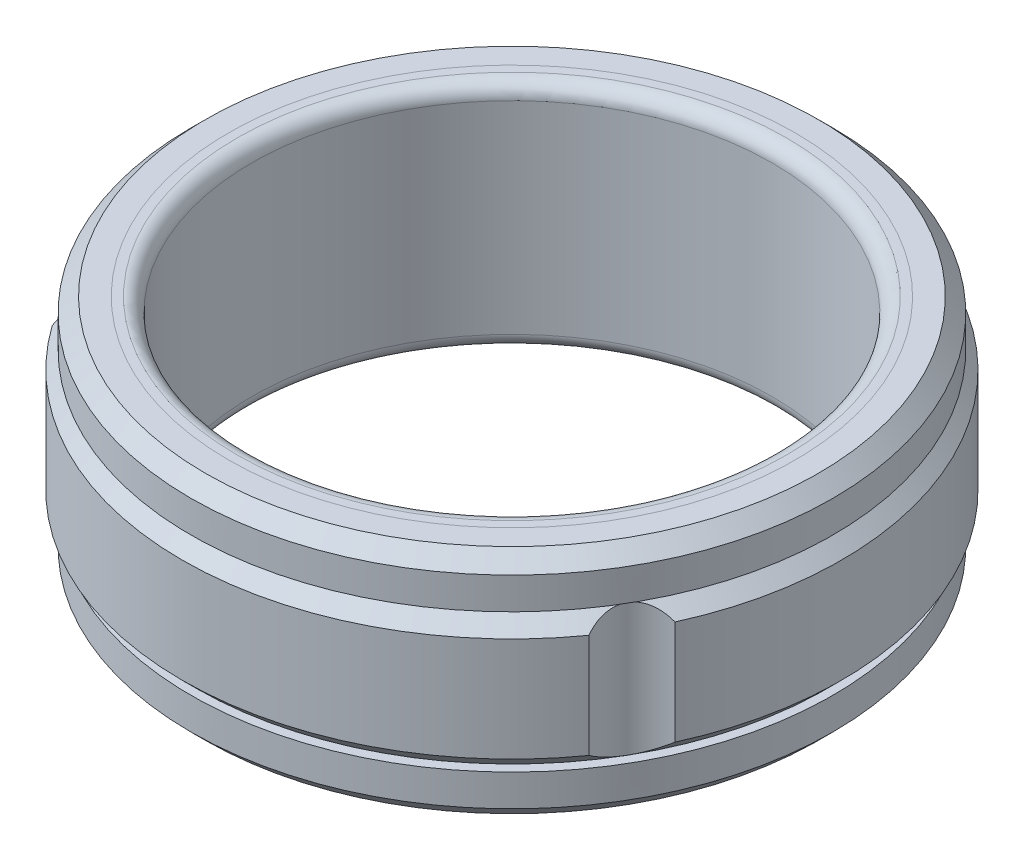
ISO-10303-21;
HEADER;
FILE_DESCRIPTION(('STEP AP214'),'2;1');
FILE_NAME('part.step','',(''),(''),'','','');
FILE_SCHEMA(('AUTOMOTIVE_DESIGN { 1 0 10303 214 1 1 1 1 }'));
ENDSEC;
DATA;
#1=APPLICATION_CONTEXT('core data for automotive mechanical design processes');
#2=APPLICATION_PROTOCOL_DEFINITION('international standard','automotive_design',2000,#1);
#3=PRODUCT_CONTEXT('',#1,'mechanical');
#4=PRODUCT('Part','Part','',(#3));
#5=PRODUCT_RELATED_PRODUCT_CATEGORY('part','',(#4));
#6=PRODUCT_DEFINITION_FORMATION('','',#4);
#7=PRODUCT_DEFINITION_CONTEXT('part definition',#1,'design');
#8=PRODUCT_DEFINITION('design','',#6,#7);
#9=PRODUCT_DEFINITION_SHAPE('','',#8);
#10=(LENGTH_UNIT() NAMED_UNIT(*) SI_UNIT(.MILLI.,.METRE.));
#11=(NAMED_UNIT(*) PLANE_ANGLE_UNIT() SI_UNIT($,.RADIAN.));
#12=(NAMED_UNIT(*) SI_UNIT($,.STERADIAN.) SOLID_ANGLE_UNIT());
#13=UNCERTAINTY_MEASURE_WITH_UNIT(LENGTH_MEASURE(1.E-05),#10,'distance_accuracy_value','');
#14=(GEOMETRIC_REPRESENTATION_CONTEXT(3) GLOBAL_UNCERTAINTY_ASSIGNED_CONTEXT((#13)) GLOBAL_UNIT_ASSIGNED_CONTEXT((#10,
#11,#12)) REPRESENTATION_CONTEXT('',''));
#15=CARTESIAN_POINT('',(0.,0.,0.));
#16=DIRECTION('',(0.,0.,1.));
#17=DIRECTION('',(1.,0.,0.));
#18=AXIS2_PLACEMENT_3D('',#15,#16,#17);
#19=CARTESIAN_POINT('',(0.,-2.4,0.));
#20=DIRECTION('',(0.,-1.,0.));
#21=DIRECTION('',(0.,0.,-1.));
#22=AXIS2_PLACEMENT_3D('',#19,#20,#21);
#23=PLANE('',#22);
#24=CARTESIAN_POINT('',(0.,-2.4,0.));
#25=DIRECTION('',(0.,-1.,0.));
#26=DIRECTION('',(0.,0.,-1.));
#27=AXIS2_PLACEMENT_3D('',#24,#25,#26);
#28=CIRCLE('',#27,11.1);
#29=CARTESIAN_POINT('',(0.,-2.4,-11.1));
#30=VERTEX_POINT('',#29);
#31=EDGE_CURVE('E70',#30,#30,#28,.T.);
#32=ORIENTED_EDGE('',*,*,#31,.F.);
#33=EDGE_LOOP('',(#32));
#34=FACE_BOUND('',#33,.T.);
#35=CARTESIAN_POINT('',(0.,-2.4,0.));
#36=DIRECTION('',(0.,-1.,0.));
#37=DIRECTION('',(0.,0.,-1.));
#38=AXIS2_PLACEMENT_3D('',#35,#36,#37);
#39=CIRCLE('',#38,9.8);
#40=CARTESIAN_POINT('',(0.,-2.4,-9.8));
#41=VERTEX_POINT('',#40);
#42=EDGE_CURVE('E79',#41,#41,#39,.T.);
#43=ORIENTED_EDGE('',*,*,#42,.T.);
#44=EDGE_LOOP('',(#43));
#45=FACE_BOUND('',#44,.T.);
#46=ADVANCED_FACE('F58',(#34,#45),#23,.F.);
#47=CARTESIAN_POINT('',(0.,0.,0.));
#48=DIRECTION('',(0.,-1.,0.));
#49=DIRECTION('',(0.,0.,-1.));
#50=AXIS2_PLACEMENT_3D('',#47,#48,#49);
#51=CYLINDRICAL_SURFACE('',#50,11.1);
#52=CARTESIAN_POINT('',(0.,-3.50000000000001,0.));
#53=DIRECTION('',(0.,1.,0.));
#54=DIRECTION('',(0.,0.,1.));
#55=AXIS2_PLACEMENT_3D('',#52,#53,#54);
#56=CIRCLE('',#55,11.1);
#57=CARTESIAN_POINT('',(0.,-3.50000000000001,11.1));
#58=VERTEX_POINT('',#57);
#59=EDGE_CURVE('E11',#58,#58,#56,.T.);
#60=ORIENTED_EDGE('',*,*,#59,.T.);
#61=EDGE_LOOP('',(#60));
#62=FACE_BOUND('',#61,.T.);
#63=ORIENTED_EDGE('',*,*,#31,.T.);
#64=EDGE_LOOP('',(#63));
#65=FACE_BOUND('',#64,.T.);
#66=ADVANCED_FACE('F96',(#62,#65),#51,.T.);
#67=CARTESIAN_POINT('',(0.,-4.,0.));
#68=DIRECTION('',(0.,1.,0.));
#69=DIRECTION('',(0.,0.,1.));
#70=AXIS2_PLACEMENT_3D('',#67,#68,#69);
#71=PLANE('',#70);
#72=CARTESIAN_POINT('',(0.,-4.,0.));
#73=DIRECTION('',(0.,1.,0.));
#74=DIRECTION('',(0.,0.,1.));
#75=AXIS2_PLACEMENT_3D('',#72,#73,#74);
#76=CIRCLE('',#75,10.6);
#77=CARTESIAN_POINT('',(0.,-4.,10.6));
#78=VERTEX_POINT('',#77);
#79=EDGE_CURVE('E66',#78,#78,#76,.F.);
#80=ORIENTED_EDGE('',*,*,#79,.T.);
#81=EDGE_LOOP('',(#80));
#82=FACE_BOUND('',#81,.T.);
#83=CARTESIAN_POINT('',(0.,-4.,0.));
#84=DIRECTION('',(0.,-1.,0.));
#85=DIRECTION('',(0.,0.,-1.));
#86=AXIS2_PLACEMENT_3D('',#83,#84,#85);
#87=CIRCLE('',#86,9.8);
#88=CARTESIAN_POINT('',(0.,-4.,-9.8));
#89=VERTEX_POINT('',#88);
#90=EDGE_CURVE('E74',#89,#89,#87,.T.);
#91=ORIENTED_EDGE('',*,*,#90,.F.);
#92=EDGE_LOOP('',(#91));
#93=FACE_BOUND('',#92,.T.);
#94=ADVANCED_FACE('F86',(#82,#93),#71,.F.);
#95=CARTESIAN_POINT('',(0.,0.,0.));
#96=DIRECTION('',(0.,-1.,0.));
#97=DIRECTION('',(0.,0.,-1.));
#98=AXIS2_PLACEMENT_3D('',#95,#96,#97);
#99=CYLINDRICAL_SURFACE('',#98,9.8);
#100=ORIENTED_EDGE('',*,*,#90,.T.);
#101=EDGE_LOOP('',(#100));
#102=FACE_BOUND('',#101,.T.);
#103=ORIENTED_EDGE('',*,*,#42,.F.);
#104=EDGE_LOOP('',(#103));
#105=FACE_BOUND('',#104,.T.);
#106=ADVANCED_FACE('F84',(#102,#105),#99,.F.);
#107=CARTESIAN_POINT('',(0.,-4.,0.));
#108=DIRECTION('',(0.,1.,0.));
#109=DIRECTION('',(0.,0.,1.));
#110=AXIS2_PLACEMENT_3D('',#107,#108,#109);
#111=CONICAL_SURFACE('',#110,10.6,0.785398163397448);
#112=ORIENTED_EDGE('',*,*,#59,.F.);
#113=EDGE_LOOP('',(#112));
#114=FACE_BOUND('',#113,.T.);
#115=ORIENTED_EDGE('',*,*,#79,.F.);
#116=EDGE_LOOP('',(#115));
#117=FACE_BOUND('',#116,.T.);
#118=ADVANCED_FACE('F61',(#114,#117),#111,.T.);
#119=CLOSED_SHELL('',(#46,#66,#94,#106,#118));
#120=MANIFOLD_SOLID_BREP('B2',#119);
#121=CARTESIAN_POINT('',(0.,4.,0.));
#122=DIRECTION('',(0.,1.,0.));
#123=DIRECTION('',(0.,0.,1.));
#124=AXIS2_PLACEMENT_3D('',#121,#122,#123);
#125=PLANE('',#124);
#126=CARTESIAN_POINT('',(0.,4.,0.));
#127=DIRECTION('',(0.,1.,0.));
#128=DIRECTION('',(0.,0.,1.));
#129=AXIS2_PLACEMENT_3D('',#126,#127,#128);
#130=CIRCLE('',#129,10.6);
#131=CARTESIAN_POINT('',(0.,4.,10.6));
#132=VERTEX_POINT('',#131);
#133=EDGE_CURVE('E57',#132,#132,#130,.T.);
#134=ORIENTED_EDGE('',*,*,#133,.T.);
#135=EDGE_LOOP('',(#134));
#136=FACE_BOUND('',#135,.T.);
#137=CARTESIAN_POINT('',(0.,4.,0.));
#138=DIRECTION('',(0.,-1.,0.));
#139=DIRECTION('',(0.,0.,-1.));
#140=AXIS2_PLACEMENT_3D('',#137,#138,#139);
#141=CIRCLE('',#140,9.8);
#142=CARTESIAN_POINT('',(0.,4.,-9.8));
#143=VERTEX_POINT('',#142);
#144=EDGE_CURVE('E172',#143,#143,#141,.T.);
#145=ORIENTED_EDGE('',*,*,#144,.T.);
#146=EDGE_LOOP('',(#145));
#147=FACE_BOUND('',#146,.T.);
#148=ADVANCED_FACE('F151',(#136,#147),#125,.T.);
#149=CARTESIAN_POINT('',(0.,0.,0.));
#150=DIRECTION('',(0.,-1.,0.));
#151=DIRECTION('',(0.,0.,-1.));
#152=AXIS2_PLACEMENT_3D('',#149,#150,#151);
#153=CYLINDRICAL_SURFACE('',#152,11.1);
#154=CARTESIAN_POINT('',(0.,3.5,0.));
#155=DIRECTION('',(0.,1.,0.));
#156=DIRECTION('',(0.,0.,1.));
#157=AXIS2_PLACEMENT_3D('',#154,#155,#156);
#158=CIRCLE('',#157,11.1);
#159=CARTESIAN_POINT('',(0.,3.5,11.1));
#160=VERTEX_POINT('',#159);
#161=EDGE_CURVE('E159',#160,#160,#158,.F.);
#162=ORIENTED_EDGE('',*,*,#161,.T.);
#163=EDGE_LOOP('',(#162));
#164=FACE_BOUND('',#163,.T.);
#165=CARTESIAN_POINT('',(0.,2.4,0.));
#166=DIRECTION('',(0.,-1.,0.));
#167=DIRECTION('',(0.,0.,-1.));
#168=AXIS2_PLACEMENT_3D('',#165,#166,#167);
#169=CIRCLE('',#168,11.1);
#170=CARTESIAN_POINT('',(0.,2.4,-11.1));
#171=VERTEX_POINT('',#170);
#172=EDGE_CURVE('E163',#171,#171,#169,.T.);
#173=ORIENTED_EDGE('',*,*,#172,.F.);
#174=EDGE_LOOP('',(#173));
#175=FACE_BOUND('',#174,.T.);
#176=ADVANCED_FACE('F188',(#164,#175),#153,.T.);
#177=CARTESIAN_POINT('',(0.,2.4,0.));
#178=DIRECTION('',(0.,-1.,0.));
#179=DIRECTION('',(0.,0.,-1.));
#180=AXIS2_PLACEMENT_3D('',#177,#178,#179);
#181=PLANE('',#180);
#182=ORIENTED_EDGE('',*,*,#172,.T.);
#183=EDGE_LOOP('',(#182));
#184=FACE_BOUND('',#183,.T.);
#185=CARTESIAN_POINT('',(0.,2.4,0.));
#186=DIRECTION('',(0.,-1.,0.));
#187=DIRECTION('',(0.,0.,-1.));
#188=AXIS2_PLACEMENT_3D('',#185,#186,#187);
#189=CIRCLE('',#188,9.8);
#190=CARTESIAN_POINT('',(0.,2.4,-9.8));
#191=VERTEX_POINT('',#190);
#192=EDGE_CURVE('E167',#191,#191,#189,.T.);
#193=ORIENTED_EDGE('',*,*,#192,.F.);
#194=EDGE_LOOP('',(#193));
#195=FACE_BOUND('',#194,.T.);
#196=ADVANCED_FACE('F179',(#184,#195),#181,.T.);
#197=CARTESIAN_POINT('',(0.,0.,0.));
#198=DIRECTION('',(0.,-1.,0.));
#199=DIRECTION('',(0.,0.,-1.));
#200=AXIS2_PLACEMENT_3D('',#197,#198,#199);
#201=CYLINDRICAL_SURFACE('',#200,9.8);
#202=ORIENTED_EDGE('',*,*,#192,.T.);
#203=EDGE_LOOP('',(#202));
#204=FACE_BOUND('',#203,.T.);
#205=ORIENTED_EDGE('',*,*,#144,.F.);
#206=EDGE_LOOP('',(#205));
#207=FACE_BOUND('',#206,.T.);
#208=ADVANCED_FACE('F177',(#204,#207),#201,.F.);
#209=CARTESIAN_POINT('',(0.,3.5,0.));
#210=DIRECTION('',(0.,-1.,0.));
#211=DIRECTION('',(0.,0.,-1.));
#212=AXIS2_PLACEMENT_3D('',#209,#210,#211);
#213=CONICAL_SURFACE('',#212,11.1,0.785398163397447);
#214=ORIENTED_EDGE('',*,*,#133,.F.);
#215=EDGE_LOOP('',(#214));
#216=FACE_BOUND('',#215,.T.);
#217=ORIENTED_EDGE('',*,*,#161,.F.);
#218=EDGE_LOOP('',(#217));
#219=FACE_BOUND('',#218,.T.);
#220=ADVANCED_FACE('F154',(#216,#219),#213,.T.);
#221=CLOSED_SHELL('',(#148,#176,#196,#208,#220));
#222=MANIFOLD_SOLID_BREP('B6',#221);
#223=CARTESIAN_POINT('',(0.,0.,0.));
#224=DIRECTION('',(0.,-1.,0.));
#225=DIRECTION('',(0.,0.,-1.));
#226=AXIS2_PLACEMENT_3D('',#223,#224,#225);
#227=CYLINDRICAL_SURFACE('',#226,11.4);
#228=CARTESIAN_POINT('',(0.,-1.8,0.));
#229=DIRECTION('',(0.,1.,0.));
#230=DIRECTION('',(0.,0.,1.));
#231=AXIS2_PLACEMENT_3D('',#228,#229,#230);
#232=CIRCLE('',#231,11.4);
#233=CARTESIAN_POINT('',(-1.09184068662096,-1.8,-11.34759375));
#234=VERTEX_POINT('',#233);
#235=CARTESIAN_POINT('',(-10.373224802636,-1.8,4.72823510350085));
#236=VERTEX_POINT('',#235);
#237=EDGE_CURVE('E323',#234,#236,#232,.T.);
#238=ORIENTED_EDGE('',*,*,#237,.T.);
#239=DIRECTION('',(0.,1.,0.));
#240=VECTOR('',#239,1.);
#241=CARTESIAN_POINT('',(-10.373224802636,0.,4.72823510350085));
#242=LINE('',#241,#240);
#243=CARTESIAN_POINT('',(-10.373224802636,1.8,4.72823510350085));
#244=VERTEX_POINT('',#243);
#245=EDGE_CURVE('E301',#236,#244,#242,.T.);
#246=ORIENTED_EDGE('',*,*,#245,.T.);
#247=CARTESIAN_POINT('',(0.,1.8,0.));
#248=DIRECTION('',(0.,-1.,0.));
#249=DIRECTION('',(0.,0.,-1.));
#250=AXIS2_PLACEMENT_3D('',#247,#248,#249);
#251=CIRCLE('',#250,11.4);
#252=CARTESIAN_POINT('',(-1.09184068662096,1.8,-11.34759375));
#253=VERTEX_POINT('',#252);
#254=EDGE_CURVE('E369',#244,#253,#251,.T.);
#255=ORIENTED_EDGE('',*,*,#254,.T.);
#256=DIRECTION('',(0.,1.,0.));
#257=VECTOR('',#256,1.);
#258=CARTESIAN_POINT('',(-1.09184068662096,0.,-11.34759375));
#259=LINE('',#258,#257);
#260=EDGE_CURVE('E425',#253,#234,#259,.F.);
#261=ORIENTED_EDGE('',*,*,#260,.T.);
#262=EDGE_LOOP('',(#238,#246,#255,#261));
#263=FACE_BOUND('',#262,.T.);
#264=ADVANCED_FACE('F241',(#263),#227,.T.);
#265=CARTESIAN_POINT('',(9.2813841160151,1.8,6.61935864649911));
#266=VERTEX_POINT('',#265);
#267=CARTESIAN_POINT('',(-9.28138411601501,1.8,6.61935864649924));
#268=VERTEX_POINT('',#267);
#269=EDGE_CURVE('E315',#266,#268,#251,.T.);
#270=ORIENTED_EDGE('',*,*,#269,.T.);
#271=DIRECTION('',(0.,1.,0.));
#272=VECTOR('',#271,1.);
#273=CARTESIAN_POINT('',(-9.28138411601501,0.,6.61935864649924));
#274=LINE('',#273,#272);
#275=CARTESIAN_POINT('',(-9.28138411601501,-1.8,6.61935864649924));
#276=VERTEX_POINT('',#275);
#277=EDGE_CURVE('E263',#268,#276,#274,.F.);
#278=ORIENTED_EDGE('',*,*,#277,.T.);
#279=CARTESIAN_POINT('',(9.2813841160151,-1.8,6.61935864649911));
#280=VERTEX_POINT('',#279);
#281=EDGE_CURVE('E313',#276,#280,#232,.T.);
#282=ORIENTED_EDGE('',*,*,#281,.T.);
#283=DIRECTION('',(0.,1.,0.));
#284=VECTOR('',#283,1.);
#285=CARTESIAN_POINT('',(9.2813841160151,0.,6.61935864649911));
#286=LINE('',#285,#284);
#287=EDGE_CURVE('E306',#280,#266,#286,.T.);
#288=ORIENTED_EDGE('',*,*,#287,.T.);
#289=EDGE_LOOP('',(#270,#278,#282,#288));
#290=FACE_BOUND('',#289,.T.);
#291=ADVANCED_FACE('F311',(#290),#227,.T.);
#292=CARTESIAN_POINT('',(-10.4,2.3,0.));
#293=DIRECTION('',(0.,-1.,0.));
#294=DIRECTION('',(0.,0.,-1.));
#295=AXIS2_PLACEMENT_3D('',#292,#293,#294);
#296=PLANE('',#295);
#297=CARTESIAN_POINT('',(0.,2.3,0.));
#298=DIRECTION('',(0.,-1.,0.));
#299=DIRECTION('',(0.,0.,-1.));
#300=AXIS2_PLACEMENT_3D('',#297,#298,#299);
#301=CIRCLE('',#300,10.9);
#302=CARTESIAN_POINT('',(0.,2.3,-10.9));
#303=VERTEX_POINT('',#302);
#304=EDGE_CURVE('E256',#303,#303,#301,.F.);
#305=ORIENTED_EDGE('',*,*,#304,.T.);
#306=EDGE_LOOP('',(#305));
#307=FACE_BOUND('',#306,.T.);
#308=CARTESIAN_POINT('',(0.,2.3,0.));
#309=DIRECTION('',(0.,-1.,0.));
#310=DIRECTION('',(0.,0.,-1.));
#311=AXIS2_PLACEMENT_3D('',#308,#309,#310);
#312=CIRCLE('',#311,10.4);
#313=CARTESIAN_POINT('',(0.,2.3,-10.4));
#314=VERTEX_POINT('',#313);
#315=EDGE_CURVE('E375',#314,#314,#312,.T.);
#316=ORIENTED_EDGE('',*,*,#315,.T.);
#317=EDGE_LOOP('',(#316));
#318=FACE_BOUND('',#317,.T.);
#319=ADVANCED_FACE('F332',(#307,#318),#296,.F.);
#320=CARTESIAN_POINT('',(1.09184068662096,1.8,-11.34759375));
#321=VERTEX_POINT('',#320);
#322=CARTESIAN_POINT('',(10.373224802636,1.8,4.72823510350071));
#323=VERTEX_POINT('',#322);
#324=EDGE_CURVE('E326',#321,#323,#251,.T.);
#325=ORIENTED_EDGE('',*,*,#324,.T.);
#326=DIRECTION('',(0.,1.,0.));
#327=VECTOR('',#326,1.);
#328=CARTESIAN_POINT('',(10.373224802636,0.,4.72823510350071));
#329=LINE('',#328,#327);
#330=CARTESIAN_POINT('',(10.373224802636,-1.8,4.72823510350071));
#331=VERTEX_POINT('',#330);
#332=EDGE_CURVE('E271',#323,#331,#329,.F.);
#333=ORIENTED_EDGE('',*,*,#332,.T.);
#334=CARTESIAN_POINT('',(1.09184068662096,-1.8,-11.34759375));
#335=VERTEX_POINT('',#334);
#336=EDGE_CURVE('E324',#331,#335,#232,.T.);
#337=ORIENTED_EDGE('',*,*,#336,.T.);
#338=DIRECTION('',(0.,1.,0.));
#339=VECTOR('',#338,1.);
#340=CARTESIAN_POINT('',(1.09184068662096,0.,-11.34759375));
#341=LINE('',#340,#339);
#342=EDGE_CURVE('E367',#335,#321,#341,.T.);
#343=ORIENTED_EDGE('',*,*,#342,.T.);
#344=EDGE_LOOP('',(#325,#333,#337,#343));
#345=FACE_BOUND('',#344,.T.);
#346=ADVANCED_FACE('F349',(#345),#227,.T.);
#347=CARTESIAN_POINT('',(-11.4,-2.3,0.));
#348=DIRECTION('',(0.,1.,0.));
#349=DIRECTION('',(0.,0.,1.));
#350=AXIS2_PLACEMENT_3D('',#347,#348,#349);
#351=PLANE('',#350);
#352=CARTESIAN_POINT('',(0.,-2.3,0.));
#353=DIRECTION('',(0.,1.,0.));
#354=DIRECTION('',(0.,0.,1.));
#355=AXIS2_PLACEMENT_3D('',#352,#353,#354);
#356=CIRCLE('',#355,10.9);
#357=CARTESIAN_POINT('',(0.,-2.3,10.9));
#358=VERTEX_POINT('',#357);
#359=EDGE_CURVE('E370',#358,#358,#356,.F.);
#360=ORIENTED_EDGE('',*,*,#359,.T.);
#361=EDGE_LOOP('',(#360));
#362=FACE_BOUND('',#361,.T.);
#363=CARTESIAN_POINT('',(0.,-2.3,0.));
#364=DIRECTION('',(0.,-1.,0.));
#365=DIRECTION('',(0.,0.,-1.));
#366=AXIS2_PLACEMENT_3D('',#363,#364,#365);
#367=CIRCLE('',#366,10.4);
#368=CARTESIAN_POINT('',(0.,-2.3,-10.4));
#369=VERTEX_POINT('',#368);
#370=EDGE_CURVE('E378',#369,#369,#367,.T.);
#371=ORIENTED_EDGE('',*,*,#370,.F.);
#372=EDGE_LOOP('',(#371));
#373=FACE_BOUND('',#372,.T.);
#374=ADVANCED_FACE('F356',(#362,#373),#351,.F.);
#375=CARTESIAN_POINT('',(0.,0.,0.));
#376=DIRECTION('',(0.,-1.,0.));
#377=DIRECTION('',(0.,0.,-1.));
#378=AXIS2_PLACEMENT_3D('',#375,#376,#377);
#379=CYLINDRICAL_SURFACE('',#378,10.4);
#380=ORIENTED_EDGE('',*,*,#315,.F.);
#381=EDGE_LOOP('',(#380));
#382=FACE_BOUND('',#381,.T.);
#383=ORIENTED_EDGE('',*,*,#370,.T.);
#384=EDGE_LOOP('',(#383));
#385=FACE_BOUND('',#384,.T.);
#386=ADVANCED_FACE('F345',(#382,#385),#379,.F.);
#387=CARTESIAN_POINT('',(0.,-2.3,0.));
#388=DIRECTION('',(0.,1.,0.));
#389=DIRECTION('',(0.,0.,1.));
#390=AXIS2_PLACEMENT_3D('',#387,#388,#389);
#391=CONICAL_SURFACE('',#390,10.9,0.785398163397447);
#392=CARTESIAN_POINT('',(-10.3734790107589,-1.7998,4.7281596053162));
#393=CARTESIAN_POINT('',(-10.3036340019016,-1.85471912322984,4.74892364805497));
#394=CARTESIAN_POINT('',(-10.2332211031702,-1.90767584685319,4.77504963109156));
#395=CARTESIAN_POINT('',(-10.0923878908588,-2.00737558127494,4.83965448036885));
#396=CARTESIAN_POINT('',(-10.0219765208745,-2.05404144510366,4.87826986789253));
#397=CARTESIAN_POINT('',(-9.90051848705293,-2.12747502842941,4.95816863365428));
#398=CARTESIAN_POINT('',(-9.8488821506007,-2.15632997333045,4.99658427309922));
#399=CARTESIAN_POINT('',(-9.7488410223565,-2.20650942403308,5.08139637513376));
#400=CARTESIAN_POINT('',(-9.70042497477749,-2.22786141277393,5.1277627654408));
#401=CARTESIAN_POINT('',(-9.60799553074373,-2.26159578625499,5.22872232965422));
#402=CARTESIAN_POINT('',(-9.56403629393217,-2.27387714252737,5.28340021926233));
#403=CARTESIAN_POINT('',(-9.48327830761241,-2.28772186808665,5.39908845455415));
#404=CARTESIAN_POINT('',(-9.44647772791409,-2.28928798035274,5.46009717555796));
#405=CARTESIAN_POINT('',(-9.38649088657364,-2.2821174308113,5.57652087990787));
#406=CARTESIAN_POINT('',(-9.36209344911795,-2.27487982297245,5.63141652537225));
#407=CARTESIAN_POINT('',(-9.32002449453818,-2.25315656492901,5.74229269318926));
#408=CARTESIAN_POINT('',(-9.302352408891,-2.23867152762071,5.79827312341969));
#409=CARTESIAN_POINT('',(-9.26980789992053,-2.19881844086457,5.92464971536672));
#410=CARTESIAN_POINT('',(-9.25689934515679,-2.17158867594329,5.99495863995748));
#411=CARTESIAN_POINT('',(-9.24056458602644,-2.10935575200583,6.13337379628729));
#412=CARTESIAN_POINT('',(-9.23717417727893,-2.07432378200215,6.2014707634526));
#413=CARTESIAN_POINT('',(-9.23861385779915,-2.00098972080452,6.3299654604742));
#414=CARTESIAN_POINT('',(-9.24293219751647,-1.96303993522261,6.39057707816322));
#415=CARTESIAN_POINT('',(-9.25780813601997,-1.88372849387343,6.50790588236535));
#416=CARTESIAN_POINT('',(-9.26830627013282,-1.84240254640996,6.56465450979498));
#417=CARTESIAN_POINT('',(-9.28144583673064,-1.7998,6.61961654628389));
#418=B_SPLINE_CURVE_WITH_KNOTS('',3,(#392,#393,#394,#395,#396,#397,#398,#399,#400,#401,#402,
#403,#404,#405,#406,#407,#408,#409,#410,#411,#412,#413,#414,#415,#416,#417),.UNSPECIFIED.,.F.,
.F.,(4,2,2,2,2,2,2,2,2,2,2,2,4),(0.,0.274314611549401,0.551735268958093,0.762533442777327,
0.972551221443923,1.18487428353444,1.39714299132943,1.57781150247377,1.75846473753289,
1.98670734513259,2.21580717962184,2.43025860619697,2.64267946215663),.UNSPECIFIED.);
#419=EDGE_CURVE('E298',#236,#276,#418,.T.);
#420=ORIENTED_EDGE('',*,*,#419,.F.);
#421=ORIENTED_EDGE('',*,*,#237,.F.);
#422=CARTESIAN_POINT('',(1.09203317402828,-1.7998,-11.3477761516));
#423=CARTESIAN_POINT('',(1.03912848110259,-1.85471912322984,-11.2976706209714));
#424=CARTESIAN_POINT('',(0.981296266728349,-1.90767584685319,-11.2497542534342));
#425=CARTESIAN_POINT('',(0.854930219890877,-2.00737558127494,-11.1600915385146));
#426=CARTESIAN_POINT('',(0.78628262832622,-2.05404144510366,-11.1184211971548));
#427=CARTESIAN_POINT('',(0.656359250534726,-2.12747502842941,-11.0531848372524));
#428=CARTESIAN_POINT('',(0.597272162646673,-2.15632997333045,-11.0276742778489));
#429=CARTESIAN_POINT('',(0.473802163614303,-2.20650942403308,-10.9834421703835));
#430=CARTESIAN_POINT('',(0.409439667937118,-2.22786141277393,-10.9646958383827));
#431=CARTESIAN_POINT('',(0.275791398556406,-2.26159578625499,-10.9351293738985));
#432=CARTESIAN_POINT('',(0.206459338724684,-2.27387714252738,-10.9243985028928));
#433=CARTESIAN_POINT('',(0.0658913948830999,-2.28772186808665,-10.9123041528273));
#434=CARTESIAN_POINT('',(-0.00534399720775561,-2.28928798035274,-10.9109382764365));
#435=CARTESIAN_POINT('',(-0.136163303447696,-2.2821174308113,-10.9172000001178));
#436=CARTESIAN_POINT('',(-0.19590304570484,-2.27487982297246,-10.9235190222261));
#437=CARTESIAN_POINT('',(-0.312959100998518,-2.25315656492901,-10.9425243227579));
#438=CARTESIAN_POINT('',(-0.370275618516446,-2.23867152762071,-10.9552100627648));
#439=CARTESIAN_POINT('',(-0.495993212071506,-2.19881844086457,-10.9902139872162));
#440=CARTESIAN_POINT('',(-0.563336804261739,-2.17158867594329,-11.0141893131601));
#441=CARTESIAN_POINT('',(-0.691375225477329,-2.10935575200584,-11.0692505749534));
#442=CARTESIAN_POINT('',(-0.752044133336914,-2.07432378200215,-11.1003628784315));
#443=CARTESIAN_POINT('',(-0.862603964949096,-2.00098972080452,-11.1658570268461));
#444=CARTESIAN_POINT('',(-0.912935995773598,-1.96303993522261,-11.199902627588));
#445=CARTESIAN_POINT('',(-1.00710775155654,-1.88372849387343,-11.2714499703382));
#446=CARTESIAN_POINT('',(-1.05100443748407,-1.84240254640996,-11.3089159348871));
#447=CARTESIAN_POINT('',(-1.09203317402828,-1.7998,-11.3477761516));
#448=B_SPLINE_CURVE_WITH_KNOTS('',3,(#422,#423,#424,#425,#426,#427,#428,#429,#430,#431,#432,
#433,#434,#435,#436,#437,#438,#439,#440,#441,#442,#443,#444,#445,#446,#447),.UNSPECIFIED.,.F.,
.F.,(4,2,2,2,2,2,2,2,2,2,2,2,4),(0.,0.274314611549399,0.551735268958093,0.762533442777327,
0.972551221443923,1.18487428353444,1.39714299132943,1.57781150247377,1.75846473753289,
1.98670734513259,2.21580717962184,2.43025860619697,2.64267946215663),.UNSPECIFIED.);
#449=EDGE_CURVE('E383',#335,#234,#448,.T.);
#450=ORIENTED_EDGE('',*,*,#449,.F.);
#451=ORIENTED_EDGE('',*,*,#336,.F.);
#452=CARTESIAN_POINT('',(9.28144583673073,-1.7998,6.61961654628376));
#453=CARTESIAN_POINT('',(9.26450552079911,-1.85471912322984,6.54874697291639));
#454=CARTESIAN_POINT('',(9.25192483644194,-1.90767584685319,6.47470462234259));
#455=CARTESIAN_POINT('',(9.23745767096805,-2.00737558127494,6.32043705814574));
#456=CARTESIAN_POINT('',(9.23569389254837,-2.05404144510366,6.24015132926221));
#457=CARTESIAN_POINT('',(9.24415923651828,-2.12747502842941,6.09501620359813));
#458=CARTESIAN_POINT('',(9.25160998795411,-2.15632997333045,6.03109000474967));
#459=CARTESIAN_POINT('',(9.27503885874227,-2.20650942403308,5.90204579524966));
#460=CARTESIAN_POINT('',(9.29098530684045,-2.22786141277393,5.83693307294189));
#461=CARTESIAN_POINT('',(9.33220413218739,-2.26159578625499,5.70640704424426));
#462=CARTESIAN_POINT('',(9.35757695520756,-2.27387714252738,5.64099828363042));
#463=CARTESIAN_POINT('',(9.41738691272938,-2.28772186808665,5.51321569827313));
#464=CARTESIAN_POINT('',(9.45182172512192,-2.28928798035274,5.45084110087848));
#465=CARTESIAN_POINT('',(9.52265419002141,-2.2821174308113,5.34067912020991));
#466=CARTESIAN_POINT('',(9.55799649482287,-2.27487982297246,5.29210249685385));
#467=CARTESIAN_POINT('',(9.63298359553677,-2.25315656492901,5.20023162956861));
#468=CARTESIAN_POINT('',(9.67262802740752,-2.23867152762071,5.15693693934508));
#469=CARTESIAN_POINT('',(9.76580111199211,-2.19881844086457,5.06556427184945));
#470=CARTESIAN_POINT('',(9.8202361494186,-2.17158867594329,5.01923067320253));
#471=CARTESIAN_POINT('',(9.93193981150384,-2.10935575200584,4.93587677866604));
#472=CARTESIAN_POINT('',(9.98921831061591,-2.07432378200215,4.89889211497882));
#473=CARTESIAN_POINT('',(10.1012178227483,-2.00098972080452,4.83589156637187));
#474=CARTESIAN_POINT('',(10.1558681932901,-1.96303993522261,4.80932554942473));
#475=CARTESIAN_POINT('',(10.2649158875766,-1.88372849387343,4.76354408797283));
#476=CARTESIAN_POINT('',(10.319310707617,-1.84240254640996,4.74426142509208));
#477=CARTESIAN_POINT('',(10.373479010759,-1.7998,4.72815960531606));
#478=B_SPLINE_CURVE_WITH_KNOTS('',3,(#452,#453,#454,#455,#456,#457,#458,#459,#460,#461,#462,
#463,#464,#465,#466,#467,#468,#469,#470,#471,#472,#473,#474,#475,#476,#477),.UNSPECIFIED.,.F.,
.F.,(4,2,2,2,2,2,2,2,2,2,2,2,4),(0.,0.2743146115494,0.551735268958093,0.762533442777326,
0.972551221443923,1.18487428353444,1.39714299132943,1.57781150247377,1.75846473753289,
1.9867073451326,2.21580717962184,2.43025860619697,2.64267946215663),.UNSPECIFIED.);
#479=EDGE_CURVE('E322',#280,#331,#478,.T.);
#480=ORIENTED_EDGE('',*,*,#479,.F.);
#481=ORIENTED_EDGE('',*,*,#281,.F.);
#482=EDGE_LOOP('',(#420,#421,#450,#451,#480,#481));
#483=FACE_BOUND('',#482,.T.);
#484=ORIENTED_EDGE('',*,*,#359,.F.);
#485=EDGE_LOOP('',(#484));
#486=FACE_BOUND('',#485,.T.);
#487=ADVANCED_FACE('F319',(#483,#486),#391,.T.);
#488=CARTESIAN_POINT('',(0.,1.8,0.));
#489=DIRECTION('',(0.,-1.,0.));
#490=DIRECTION('',(0.,0.,-1.));
#491=AXIS2_PLACEMENT_3D('',#488,#489,#490);
#492=CONICAL_SURFACE('',#491,11.4,0.785398163397448);
#493=CARTESIAN_POINT('',(-9.28144583673064,1.7998,6.61961654628389));
#494=CARTESIAN_POINT('',(-9.26450552079902,1.85471912322984,6.54874697291652));
#495=CARTESIAN_POINT('',(-9.25192483644185,1.90767584685318,6.47470462234272));
#496=CARTESIAN_POINT('',(-9.23745767096796,2.00737558127493,6.32043705814587));
#497=CARTESIAN_POINT('',(-9.23569389254829,2.05404144510365,6.24015132926233));
#498=CARTESIAN_POINT('',(-9.2441592365182,2.12747502842941,6.09501620359825));
#499=CARTESIAN_POINT('',(-9.25160998795403,2.15632997333044,6.0310900047498));
#500=CARTESIAN_POINT('',(-9.27503885874219,2.20650942403308,5.90204579524979));
#501=CARTESIAN_POINT('',(-9.29098530684037,2.22786141277393,5.83693307294202));
#502=CARTESIAN_POINT('',(-9.33220413218732,2.26159578625498,5.70640704424439));
#503=CARTESIAN_POINT('',(-9.35757695520748,2.27387714252737,5.64099828363055));
#504=CARTESIAN_POINT('',(-9.41738691272931,2.28772186808665,5.51321569827326));
#505=CARTESIAN_POINT('',(-9.45182172512185,2.28928798035273,5.45084110087862));
#506=CARTESIAN_POINT('',(-9.52265419002134,2.2821174308113,5.34067912021004));
#507=CARTESIAN_POINT('',(-9.55799649482279,2.27487982297245,5.29210249685398));
#508=CARTESIAN_POINT('',(-9.6329835955367,2.25315656492901,5.20023162956875));
#509=CARTESIAN_POINT('',(-9.67262802740745,2.2386715276207,5.15693693934522));
#510=CARTESIAN_POINT('',(-9.76580111199204,2.19881844086456,5.06556427184959));
#511=CARTESIAN_POINT('',(-9.82023614941853,2.17158867594328,5.01923067320267));
#512=CARTESIAN_POINT('',(-9.93193981150377,2.10935575200583,4.93587677866617));
#513=CARTESIAN_POINT('',(-9.98921831061585,2.07432378200215,4.89889211497896));
#514=CARTESIAN_POINT('',(-10.1012178227483,2.00098972080451,4.83589156637201));
#515=CARTESIAN_POINT('',(-10.1558681932901,1.96303993522261,4.80932554942487));
#516=CARTESIAN_POINT('',(-10.2649158875765,1.88372849387342,4.76354408797298));
#517=CARTESIAN_POINT('',(-10.3193107076169,1.84240254640996,4.74426142509223));
#518=CARTESIAN_POINT('',(-10.3734790107589,1.7998,4.7281596053162));
#519=B_SPLINE_CURVE_WITH_KNOTS('',3,(#493,#494,#495,#496,#497,#498,#499,#500,#501,#502,#503,
#504,#505,#506,#507,#508,#509,#510,#511,#512,#513,#514,#515,#516,#517,#518),.UNSPECIFIED.,.F.,
.F.,(4,2,2,2,2,2,2,2,2,2,2,2,4),(0.,0.274314611549401,0.551735268958093,0.762533442777327,
0.972551221443922,1.18487428353444,1.39714299132943,1.57781150247376,1.75846473753288,
1.98670734513259,2.21580717962184,2.43025860619697,2.64267946215663),.UNSPECIFIED.);
#520=EDGE_CURVE('E316',#268,#244,#519,.T.);
#521=ORIENTED_EDGE('',*,*,#520,.F.);
#522=ORIENTED_EDGE('',*,*,#269,.F.);
#523=CARTESIAN_POINT('',(10.373479010759,1.7998,4.72815960531606));
#524=CARTESIAN_POINT('',(10.3036340019017,1.85471912322984,4.74892364805482));
#525=CARTESIAN_POINT('',(10.2332211031703,1.90767584685319,4.77504963109142));
#526=CARTESIAN_POINT('',(10.0923878908589,2.00737558127493,4.83965448036871));
#527=CARTESIAN_POINT('',(10.0219765208746,2.05404144510365,4.87826986789239));
#528=CARTESIAN_POINT('',(9.90051848705299,2.12747502842941,4.95816863365415));
#529=CARTESIAN_POINT('',(9.84888215060077,2.15632997333045,4.99658427309909));
#530=CARTESIAN_POINT('',(9.74884102235657,2.20650942403308,5.08139637513362));
#531=CARTESIAN_POINT('',(9.70042497477756,2.22786141277393,5.12776276544067));
#532=CARTESIAN_POINT('',(9.6079955307438,2.26159578625498,5.22872232965409));
#533=CARTESIAN_POINT('',(9.56403629393224,2.27387714252737,5.2834002192622));
#534=CARTESIAN_POINT('',(9.48327830761248,2.28772186808665,5.39908845455401));
#535=CARTESIAN_POINT('',(9.44647772791416,2.28928798035273,5.46009717555782));
#536=CARTESIAN_POINT('',(9.38649088657372,2.2821174308113,5.57652087990774));
#537=CARTESIAN_POINT('',(9.36209344911803,2.27487982297245,5.63141652537212));
#538=CARTESIAN_POINT('',(9.32002449453826,2.25315656492901,5.74229269318913));
#539=CARTESIAN_POINT('',(9.30235240889108,2.2386715276207,5.79827312341957));
#540=CARTESIAN_POINT('',(9.26980789992061,2.19881844086456,5.92464971536659));
#541=CARTESIAN_POINT('',(9.25689934515687,2.17158867594328,5.99495863995735));
#542=CARTESIAN_POINT('',(9.24056458602652,2.10935575200583,6.13337379628717));
#543=CARTESIAN_POINT('',(9.23717417727901,2.07432378200215,6.20147076345247));
#544=CARTESIAN_POINT('',(9.23861385779923,2.00098972080451,6.32996546047408));
#545=CARTESIAN_POINT('',(9.24293219751655,1.96303993522261,6.3905770781631));
#546=CARTESIAN_POINT('',(9.25780813602006,1.88372849387343,6.50790588236523));
#547=CARTESIAN_POINT('',(9.26830627013291,1.84240254640996,6.56465450979485));
#548=CARTESIAN_POINT('',(9.28144583673073,1.7998,6.61961654628376));
#549=B_SPLINE_CURVE_WITH_KNOTS('',3,(#523,#524,#525,#526,#527,#528,#529,#530,#531,#532,#533,
#534,#535,#536,#537,#538,#539,#540,#541,#542,#543,#544,#545,#546,#547,#548),.UNSPECIFIED.,.F.,
.F.,(4,2,2,2,2,2,2,2,2,2,2,2,4),(0.,0.2743146115494,0.551735268958093,0.762533442777327,
0.972551221443922,1.18487428353444,1.39714299132943,1.57781150247377,1.75846473753288,
1.9867073451326,2.21580717962184,2.43025860619697,2.64267946215663),.UNSPECIFIED.);
#550=EDGE_CURVE('E405',#323,#266,#549,.T.);
#551=ORIENTED_EDGE('',*,*,#550,.F.);
#552=ORIENTED_EDGE('',*,*,#324,.F.);
#553=CARTESIAN_POINT('',(-1.09203317402828,1.7998,-11.3477761516));
#554=CARTESIAN_POINT('',(-1.03912848110259,1.85471912322984,-11.2976706209714));
#555=CARTESIAN_POINT('',(-0.981296266728348,1.90767584685319,-11.2497542534342));
#556=CARTESIAN_POINT('',(-0.854930219890876,2.00737558127493,-11.1600915385146));
#557=CARTESIAN_POINT('',(-0.786282628326219,2.05404144510365,-11.1184211971548));
#558=CARTESIAN_POINT('',(-0.656359250534725,2.12747502842941,-11.0531848372524));
#559=CARTESIAN_POINT('',(-0.597272162646672,2.15632997333045,-11.0276742778489));
#560=CARTESIAN_POINT('',(-0.473802163614302,2.20650942403308,-10.9834421703835));
#561=CARTESIAN_POINT('',(-0.409439667937117,2.22786141277393,-10.9646958383827));
#562=CARTESIAN_POINT('',(-0.275791398556406,2.26159578625498,-10.9351293738985));
#563=CARTESIAN_POINT('',(-0.206459338724683,2.27387714252737,-10.9243985028928));
#564=CARTESIAN_POINT('',(-0.0658913948830994,2.28772186808665,-10.9123041528273));
#565=CARTESIAN_POINT('',(0.0053439972077561,2.28928798035273,-10.9109382764365));
#566=CARTESIAN_POINT('',(0.136163303447697,2.2821174308113,-10.9172000001178));
#567=CARTESIAN_POINT('',(0.195903045704841,2.27487982297245,-10.9235190222261));
#568=CARTESIAN_POINT('',(0.312959100998519,2.25315656492901,-10.9425243227579));
#569=CARTESIAN_POINT('',(0.370275618516447,2.2386715276207,-10.9552100627648));
#570=CARTESIAN_POINT('',(0.495993212071508,2.19881844086456,-10.9902139872162));
#571=CARTESIAN_POINT('',(0.563336804261741,2.17158867594329,-11.0141893131601));
#572=CARTESIAN_POINT('',(0.691375225477332,2.10935575200583,-11.0692505749534));
#573=CARTESIAN_POINT('',(0.752044133336917,2.07432378200215,-11.1003628784315));
#574=CARTESIAN_POINT('',(0.862603964949098,2.00098972080451,-11.1658570268461));
#575=CARTESIAN_POINT('',(0.9129359957736,1.96303993522261,-11.199902627588));
#576=CARTESIAN_POINT('',(1.00710775155654,1.88372849387343,-11.2714499703382));
#577=CARTESIAN_POINT('',(1.05100443748407,1.84240254640996,-11.3089159348871));
#578=CARTESIAN_POINT('',(1.09203317402828,1.7998,-11.3477761516));
#579=B_SPLINE_CURVE_WITH_KNOTS('',3,(#553,#554,#555,#556,#557,#558,#559,#560,#561,#562,#563,
#564,#565,#566,#567,#568,#569,#570,#571,#572,#573,#574,#575,#576,#577,#578),.UNSPECIFIED.,.F.,
.F.,(4,2,2,2,2,2,2,2,2,2,2,2,4),(0.,0.2743146115494,0.551735268958093,0.762533442777327,
0.972551221443923,1.18487428353444,1.39714299132943,1.57781150247377,1.75846473753289,
1.9867073451326,2.21580717962184,2.43025860619697,2.64267946215663),.UNSPECIFIED.);
#580=EDGE_CURVE('E149',#253,#321,#579,.T.);
#581=ORIENTED_EDGE('',*,*,#580,.F.);
#582=ORIENTED_EDGE('',*,*,#254,.F.);
#583=EDGE_LOOP('',(#521,#522,#551,#552,#581,#582));
#584=FACE_BOUND('',#583,.T.);
#585=ORIENTED_EDGE('',*,*,#304,.F.);
#586=EDGE_LOOP('',(#585));
#587=FACE_BOUND('',#586,.T.);
#588=ADVANCED_FACE('F244',(#584,#587),#492,.T.);
#589=CARTESIAN_POINT('',(0.,-5.,-12.5));
#590=DIRECTION('',(0.,1.,0.));
#591=DIRECTION('',(0.,0.,1.));
#592=AXIS2_PLACEMENT_3D('',#589,#590,#591);
#593=CYLINDRICAL_SURFACE('',#592,1.5875);
#594=ORIENTED_EDGE('',*,*,#449,.T.);
#595=ORIENTED_EDGE('',*,*,#260,.F.);
#596=ORIENTED_EDGE('',*,*,#580,.T.);
#597=ORIENTED_EDGE('',*,*,#342,.F.);
#598=EDGE_LOOP('',(#594,#595,#596,#597));
#599=FACE_BOUND('',#598,.T.);
#600=ADVANCED_FACE('F336',(#599),#593,.F.);
#601=CARTESIAN_POINT('',(10.8253175473055,-5.,6.2499999999999));
#602=DIRECTION('',(0.,1.,0.));
#603=DIRECTION('',(-0.866025403784443,0.,-0.499999999999992));
#604=AXIS2_PLACEMENT_3D('',#601,#602,#603);
#605=CYLINDRICAL_SURFACE('',#604,1.5875);
#606=ORIENTED_EDGE('',*,*,#479,.T.);
#607=ORIENTED_EDGE('',*,*,#332,.F.);
#608=ORIENTED_EDGE('',*,*,#550,.T.);
#609=ORIENTED_EDGE('',*,*,#287,.F.);
#610=EDGE_LOOP('',(#606,#607,#608,#609));
#611=FACE_BOUND('',#610,.T.);
#612=ADVANCED_FACE('F343',(#611),#605,.F.);
#613=CARTESIAN_POINT('',(-10.8253175473055,-5.,6.25000000000005));
#614=DIRECTION('',(0.,1.,0.));
#615=DIRECTION('',(0.866025403784436,0.,-0.500000000000004));
#616=AXIS2_PLACEMENT_3D('',#613,#614,#615);
#617=CYLINDRICAL_SURFACE('',#616,1.5875);
#618=ORIENTED_EDGE('',*,*,#419,.T.);
#619=ORIENTED_EDGE('',*,*,#277,.F.);
#620=ORIENTED_EDGE('',*,*,#520,.T.);
#621=ORIENTED_EDGE('',*,*,#245,.F.);
#622=EDGE_LOOP('',(#618,#619,#620,#621));
#623=FACE_BOUND('',#622,.T.);
#624=ADVANCED_FACE('F299',(#623),#617,.F.);
#625=CLOSED_SHELL('',(#264,#291,#319,#346,#374,#386,#487,#588,#600,#612,#624));
#626=MANIFOLD_SOLID_BREP('B52',#625);
#627=CARTESIAN_POINT('',(0.,-2.4,0.));
#628=DIRECTION('',(0.,1.,0.));
#629=DIRECTION('',(0.,0.,1.));
#630=AXIS2_PLACEMENT_3D('',#627,#628,#629);
#631=PLANE('',#630);
#632=CARTESIAN_POINT('',(0.,-2.4,0.));
#633=DIRECTION('',(0.,-1.,0.));
#634=DIRECTION('',(0.,0.,-1.));
#635=AXIS2_PLACEMENT_3D('',#632,#633,#634);
#636=CIRCLE('',#635,9.8);
#637=CARTESIAN_POINT('',(0.,-2.4,-9.8));
#638=VERTEX_POINT('',#637);
#639=EDGE_CURVE('E544',#638,#638,#636,.T.);
#640=ORIENTED_EDGE('',*,*,#639,.F.);
#641=EDGE_LOOP('',(#640));
#642=FACE_BOUND('',#641,.T.);
#643=CARTESIAN_POINT('',(0.,-2.4,0.));
#644=DIRECTION('',(0.,-1.,0.));
#645=DIRECTION('',(0.,0.,-1.));
#646=AXIS2_PLACEMENT_3D('',#643,#644,#645);
#647=CIRCLE('',#646,10.3);
#648=CARTESIAN_POINT('',(0.,-2.4,-10.3));
#649=VERTEX_POINT('',#648);
#650=EDGE_CURVE('E564',#649,#649,#647,.T.);
#651=ORIENTED_EDGE('',*,*,#650,.T.);
#652=EDGE_LOOP('',(#651));
#653=FACE_BOUND('',#652,.T.);
#654=ADVANCED_FACE('F520',(#642,#653),#631,.F.);
#655=CARTESIAN_POINT('',(0.,0.,0.));
#656=DIRECTION('',(0.,-1.,0.));
#657=DIRECTION('',(0.,0.,-1.));
#658=AXIS2_PLACEMENT_3D('',#655,#656,#657);
#659=CYLINDRICAL_SURFACE('',#658,9.8);
#660=CARTESIAN_POINT('',(0.,-4.,0.));
#661=DIRECTION('',(0.,-1.,0.));
#662=DIRECTION('',(0.,0.,-1.));
#663=AXIS2_PLACEMENT_3D('',#660,#661,#662);
#664=CIRCLE('',#663,9.8);
#665=CARTESIAN_POINT('',(0.,-4.,-9.8));
#666=VERTEX_POINT('',#665);
#667=EDGE_CURVE('E548',#666,#666,#664,.T.);
#668=ORIENTED_EDGE('',*,*,#667,.F.);
#669=EDGE_LOOP('',(#668));
#670=FACE_BOUND('',#669,.T.);
#671=ORIENTED_EDGE('',*,*,#639,.T.);
#672=EDGE_LOOP('',(#671));
#673=FACE_BOUND('',#672,.T.);
#674=ADVANCED_FACE('F601',(#670,#673),#659,.T.);
#675=CARTESIAN_POINT('',(0.,-4.,0.));
#676=DIRECTION('',(0.,-1.,0.));
#677=DIRECTION('',(0.,0.,-1.));
#678=AXIS2_PLACEMENT_3D('',#675,#676,#677);
#679=PLANE('',#678);
#680=CARTESIAN_POINT('',(0.,-4.,0.));
#681=DIRECTION('',(0.,-1.,0.));
#682=DIRECTION('',(0.,0.,-1.));
#683=AXIS2_PLACEMENT_3D('',#680,#681,#682);
#684=CIRCLE('',#683,9.5);
#685=CARTESIAN_POINT('',(0.,-4.,-9.5));
#686=VERTEX_POINT('',#685);
#687=EDGE_CURVE('E528',#686,#686,#684,.F.);
#688=ORIENTED_EDGE('',*,*,#687,.T.);
#689=EDGE_LOOP('',(#688));
#690=FACE_BOUND('',#689,.T.);
#691=ORIENTED_EDGE('',*,*,#667,.T.);
#692=EDGE_LOOP('',(#691));
#693=FACE_BOUND('',#692,.T.);
#694=ADVANCED_FACE('F597',(#690,#693),#679,.T.);
#695=CARTESIAN_POINT('',(0.,0.,0.));
#696=DIRECTION('',(0.,-1.,0.));
#697=DIRECTION('',(0.,0.,-1.));
#698=AXIS2_PLACEMENT_3D('',#695,#696,#697);
#699=CYLINDRICAL_SURFACE('',#698,9.);
#700=CARTESIAN_POINT('',(0.,-3.5,0.));
#701=DIRECTION('',(0.,-1.,0.));
#702=DIRECTION('',(0.,0.,-1.));
#703=AXIS2_PLACEMENT_3D('',#700,#701,#702);
#704=CIRCLE('',#703,9.);
#705=CARTESIAN_POINT('',(0.,-3.5,-9.));
#706=VERTEX_POINT('',#705);
#707=EDGE_CURVE('E533',#706,#706,#704,.T.);
#708=ORIENTED_EDGE('',*,*,#707,.T.);
#709=EDGE_LOOP('',(#708));
#710=FACE_BOUND('',#709,.T.);
#711=CARTESIAN_POINT('',(0.,3.5,0.));
#712=DIRECTION('',(0.,1.,0.));
#713=DIRECTION('',(0.,0.,1.));
#714=AXIS2_PLACEMENT_3D('',#711,#712,#713);
#715=CIRCLE('',#714,9.);
#716=CARTESIAN_POINT('',(0.,3.5,9.));
#717=VERTEX_POINT('',#716);
#718=EDGE_CURVE('E538',#717,#717,#715,.T.);
#719=ORIENTED_EDGE('',*,*,#718,.T.);
#720=EDGE_LOOP('',(#719));
#721=FACE_BOUND('',#720,.T.);
#722=ADVANCED_FACE('F591',(#710,#721),#699,.F.);
#723=CARTESIAN_POINT('',(0.,4.,0.));
#724=DIRECTION('',(0.,1.,0.));
#725=DIRECTION('',(0.,0.,1.));
#726=AXIS2_PLACEMENT_3D('',#723,#724,#725);
#727=PLANE('',#726);
#728=CARTESIAN_POINT('',(0.,4.,0.));
#729=DIRECTION('',(0.,1.,0.));
#730=DIRECTION('',(0.,0.,1.));
#731=AXIS2_PLACEMENT_3D('',#728,#729,#730);
#732=CIRCLE('',#731,9.5);
#733=CARTESIAN_POINT('',(0.,4.,9.5));
#734=VERTEX_POINT('',#733);
#735=EDGE_CURVE('E240',#734,#734,#732,.F.);
#736=ORIENTED_EDGE('',*,*,#735,.T.);
#737=EDGE_LOOP('',(#736));
#738=FACE_BOUND('',#737,.T.);
#739=CARTESIAN_POINT('',(0.,4.,0.));
#740=DIRECTION('',(0.,-1.,0.));
#741=DIRECTION('',(0.,0.,-1.));
#742=AXIS2_PLACEMENT_3D('',#739,#740,#741);
#743=CIRCLE('',#742,9.8);
#744=CARTESIAN_POINT('',(0.,4.,-9.8));
#745=VERTEX_POINT('',#744);
#746=EDGE_CURVE('E552',#745,#745,#743,.T.);
#747=ORIENTED_EDGE('',*,*,#746,.F.);
#748=EDGE_LOOP('',(#747));
#749=FACE_BOUND('',#748,.T.);
#750=ADVANCED_FACE('F586',(#738,#749),#727,.T.);
#751=CARTESIAN_POINT('',(0.,0.,0.));
#752=DIRECTION('',(0.,-1.,0.));
#753=DIRECTION('',(0.,0.,-1.));
#754=AXIS2_PLACEMENT_3D('',#751,#752,#753);
#755=CYLINDRICAL_SURFACE('',#754,9.8);
#756=CARTESIAN_POINT('',(0.,2.4,0.));
#757=DIRECTION('',(0.,-1.,0.));
#758=DIRECTION('',(0.,0.,-1.));
#759=AXIS2_PLACEMENT_3D('',#756,#757,#758);
#760=CIRCLE('',#759,9.8);
#761=CARTESIAN_POINT('',(0.,2.4,-9.8));
#762=VERTEX_POINT('',#761);
#763=EDGE_CURVE('E556',#762,#762,#760,.T.);
#764=ORIENTED_EDGE('',*,*,#763,.F.);
#765=EDGE_LOOP('',(#764));
#766=FACE_BOUND('',#765,.T.);
#767=ORIENTED_EDGE('',*,*,#746,.T.);
#768=EDGE_LOOP('',(#767));
#769=FACE_BOUND('',#768,.T.);
#770=ADVANCED_FACE('F580',(#766,#769),#755,.T.);
#771=CARTESIAN_POINT('',(0.,2.4,0.));
#772=DIRECTION('',(0.,-1.,0.));
#773=DIRECTION('',(0.,0.,-1.));
#774=AXIS2_PLACEMENT_3D('',#771,#772,#773);
#775=PLANE('',#774);
#776=CARTESIAN_POINT('',(0.,2.4,0.));
#777=DIRECTION('',(0.,-1.,0.));
#778=DIRECTION('',(0.,0.,-1.));
#779=AXIS2_PLACEMENT_3D('',#776,#777,#778);
#780=CIRCLE('',#779,10.3);
#781=CARTESIAN_POINT('',(0.,2.4,-10.3));
#782=VERTEX_POINT('',#781);
#783=EDGE_CURVE('E560',#782,#782,#780,.T.);
#784=ORIENTED_EDGE('',*,*,#783,.F.);
#785=EDGE_LOOP('',(#784));
#786=FACE_BOUND('',#785,.T.);
#787=ORIENTED_EDGE('',*,*,#763,.T.);
#788=EDGE_LOOP('',(#787));
#789=FACE_BOUND('',#788,.T.);
#790=ADVANCED_FACE('F574',(#786,#789),#775,.F.);
#791=CARTESIAN_POINT('',(0.,0.,0.));
#792=DIRECTION('',(0.,-1.,0.));
#793=DIRECTION('',(0.,0.,-1.));
#794=AXIS2_PLACEMENT_3D('',#791,#792,#793);
#795=CYLINDRICAL_SURFACE('',#794,10.3);
#796=ORIENTED_EDGE('',*,*,#650,.F.);
#797=EDGE_LOOP('',(#796));
#798=FACE_BOUND('',#797,.T.);
#799=ORIENTED_EDGE('',*,*,#783,.T.);
#800=EDGE_LOOP('',(#799));
#801=FACE_BOUND('',#800,.T.);
#802=ADVANCED_FACE('F570',(#798,#801),#795,.T.);
#803=CARTESIAN_POINT('',(0.,-3.5,0.));
#804=DIRECTION('',(0.,-1.,0.));
#805=DIRECTION('',(0.,0.,-1.));
#806=AXIS2_PLACEMENT_3D('',#803,#804,#805);
#807=TOROIDAL_SURFACE('',#806,9.5,0.5);
#808=ORIENTED_EDGE('',*,*,#687,.F.);
#809=EDGE_LOOP('',(#808));
#810=FACE_BOUND('',#809,.T.);
#811=ORIENTED_EDGE('',*,*,#707,.F.);
#812=EDGE_LOOP('',(#811));
#813=FACE_BOUND('',#812,.T.);
#814=ADVANCED_FACE('F573',(#810,#813),#807,.T.);
#815=CARTESIAN_POINT('',(0.,3.5,0.));
#816=DIRECTION('',(0.,1.,0.));
#817=DIRECTION('',(0.,0.,1.));
#818=AXIS2_PLACEMENT_3D('',#815,#816,#817);
#819=TOROIDAL_SURFACE('',#818,9.5,0.5);
#820=ORIENTED_EDGE('',*,*,#718,.F.);
#821=EDGE_LOOP('',(#820));
#822=FACE_BOUND('',#821,.T.);
#823=ORIENTED_EDGE('',*,*,#735,.F.);
#824=EDGE_LOOP('',(#823));
#825=FACE_BOUND('',#824,.T.);
#826=ADVANCED_FACE('F522',(#822,#825),#819,.T.);
#827=CLOSED_SHELL('',(#654,#674,#694,#722,#750,#770,#790,#802,#814,#826));
#828=MANIFOLD_SOLID_BREP('B143',#827);
#829=ADVANCED_BREP_SHAPE_REPRESENTATION('',(#18,#120,#222,#626,#828),#14);
#830=SHAPE_DEFINITION_REPRESENTATION(#9,#829);
ENDSEC;
END-ISO-10303-21;
